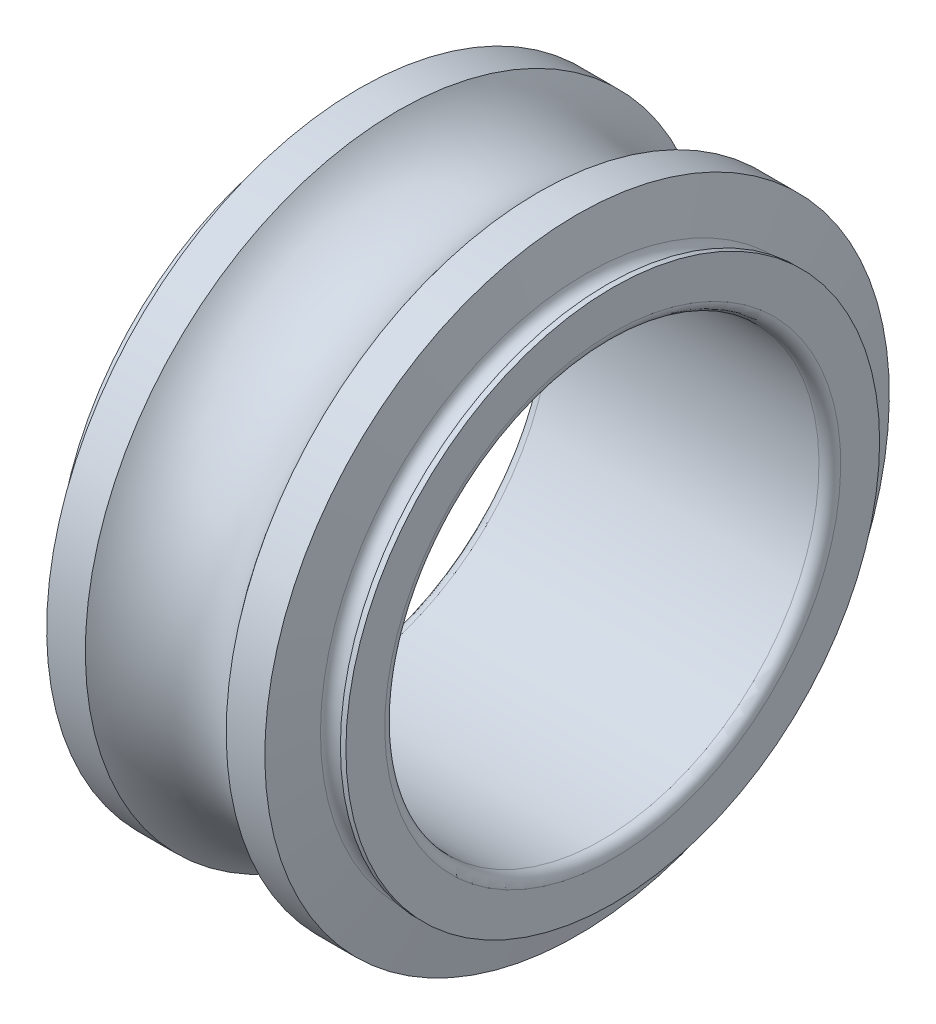
ISO-10303-21;
HEADER;
FILE_DESCRIPTION(('STEP AP214'),'2;1');
FILE_NAME('part.step','',(''),(''),'','','');
FILE_SCHEMA(('AUTOMOTIVE_DESIGN { 1 0 10303 214 1 1 1 1 }'));
ENDSEC;
DATA;
#1=APPLICATION_CONTEXT('core data for automotive mechanical design processes');
#2=APPLICATION_PROTOCOL_DEFINITION('international standard','automotive_design',2000,#1);
#3=PRODUCT_CONTEXT('',#1,'mechanical');
#4=PRODUCT('Part','Part','',(#3));
#5=PRODUCT_RELATED_PRODUCT_CATEGORY('part','',(#4));
#6=PRODUCT_DEFINITION_FORMATION('','',#4);
#7=PRODUCT_DEFINITION_CONTEXT('part definition',#1,'design');
#8=PRODUCT_DEFINITION('design','',#6,#7);
#9=PRODUCT_DEFINITION_SHAPE('','',#8);
#10=(LENGTH_UNIT() NAMED_UNIT(*) SI_UNIT(.MILLI.,.METRE.));
#11=(NAMED_UNIT(*) PLANE_ANGLE_UNIT() SI_UNIT($,.RADIAN.));
#12=(NAMED_UNIT(*) SI_UNIT($,.STERADIAN.) SOLID_ANGLE_UNIT());
#13=UNCERTAINTY_MEASURE_WITH_UNIT(LENGTH_MEASURE(1.E-05),#10,'distance_accuracy_value','');
#14=(GEOMETRIC_REPRESENTATION_CONTEXT(3) GLOBAL_UNCERTAINTY_ASSIGNED_CONTEXT((#13)) GLOBAL_UNIT_ASSIGNED_CONTEXT((#10,
#11,#12)) REPRESENTATION_CONTEXT('',''));
#15=CARTESIAN_POINT('',(0.,0.,0.));
#16=DIRECTION('',(0.,0.,1.));
#17=DIRECTION('',(1.,0.,0.));
#18=AXIS2_PLACEMENT_3D('',#15,#16,#17);
#19=CARTESIAN_POINT('',(6.48036660683857,0.,0.));
#20=DIRECTION('',(-1.,0.,0.));
#21=DIRECTION('',(0.,1.,0.));
#22=AXIS2_PLACEMENT_3D('',#19,#20,#21);
#23=CYLINDRICAL_SURFACE('',#22,8.62875);
#24=CARTESIAN_POINT('',(5.94649285575365,0.,0.));
#25=DIRECTION('',(1.,0.,0.));
#26=DIRECTION('',(0.,1.,0.));
#27=AXIS2_PLACEMENT_3D('',#24,#25,#26);
#28=CIRCLE('',#27,8.62875);
#29=CARTESIAN_POINT('',(5.94649285575365,8.62875,0.));
#30=VERTEX_POINT('',#29);
#31=EDGE_CURVE('E11',#30,#30,#28,.T.);
#32=ORIENTED_EDGE('',*,*,#31,.T.);
#33=EDGE_LOOP('',(#32));
#34=FACE_BOUND('',#33,.T.);
#35=CARTESIAN_POINT('',(7.0142403579235,0.,0.));
#36=DIRECTION('',(1.,0.,0.));
#37=DIRECTION('',(0.,1.,0.));
#38=AXIS2_PLACEMENT_3D('',#35,#36,#37);
#39=CIRCLE('',#38,8.62875);
#40=CARTESIAN_POINT('',(7.0142403579235,8.62875,0.));
#41=VERTEX_POINT('',#40);
#42=EDGE_CURVE('E91',#41,#41,#39,.T.);
#43=ORIENTED_EDGE('',*,*,#42,.F.);
#44=EDGE_LOOP('',(#43));
#45=FACE_BOUND('',#44,.T.);
#46=ADVANCED_FACE('F17',(#34,#45),#23,.T.);
#47=CARTESIAN_POINT('',(4.,0.,0.));
#48=DIRECTION('',(1.,0.,0.));
#49=DIRECTION('',(0.,0.,-1.));
#50=AXIS2_PLACEMENT_3D('',#47,#48,#49);
#51=TOROIDAL_SURFACE('',#50,10.,2.381);
#52=CARTESIAN_POINT('',(2.05350714424635,0.,0.));
#53=DIRECTION('',(1.,0.,0.));
#54=DIRECTION('',(0.,1.,0.));
#55=AXIS2_PLACEMENT_3D('',#52,#53,#54);
#56=CIRCLE('',#55,8.62875);
#57=CARTESIAN_POINT('',(2.05350714424635,8.62875,0.));
#58=VERTEX_POINT('',#57);
#59=EDGE_CURVE('E26',#58,#58,#56,.T.);
#60=ORIENTED_EDGE('',*,*,#59,.T.);
#61=EDGE_LOOP('',(#60));
#62=FACE_BOUND('',#61,.T.);
#63=ORIENTED_EDGE('',*,*,#31,.F.);
#64=EDGE_LOOP('',(#63));
#65=FACE_BOUND('',#64,.T.);
#66=ADVANCED_FACE('F124',(#62,#65),#51,.F.);
#67=CARTESIAN_POINT('',(1.51963339316143,0.,0.));
#68=DIRECTION('',(-1.,0.,0.));
#69=DIRECTION('',(0.,1.,0.));
#70=AXIS2_PLACEMENT_3D('',#67,#68,#69);
#71=CYLINDRICAL_SURFACE('',#70,8.62875);
#72=CARTESIAN_POINT('',(0.985759642076505,0.,0.));
#73=DIRECTION('',(1.,0.,0.));
#74=DIRECTION('',(0.,1.,0.));
#75=AXIS2_PLACEMENT_3D('',#72,#73,#74);
#76=CIRCLE('',#75,8.62875);
#77=CARTESIAN_POINT('',(0.985759642076504,8.62875,0.));
#78=VERTEX_POINT('',#77);
#79=EDGE_CURVE('E78',#78,#78,#76,.T.);
#80=ORIENTED_EDGE('',*,*,#79,.T.);
#81=EDGE_LOOP('',(#80));
#82=FACE_BOUND('',#81,.T.);
#83=ORIENTED_EDGE('',*,*,#59,.F.);
#84=EDGE_LOOP('',(#83));
#85=FACE_BOUND('',#84,.T.);
#86=ADVANCED_FACE('F129',(#82,#85),#71,.T.);
#87=CARTESIAN_POINT('',(0.870570599496108,0.,0.));
#88=DIRECTION('',(1.,0.,0.));
#89=DIRECTION('',(0.,1.,0.));
#90=AXIS2_PLACEMENT_3D('',#87,#88,#89);
#91=CONICAL_SURFACE('',#90,7.97548047699463,1.39626340159546);
#92=CARTESIAN_POINT('',(0.755381556915711,0.,0.));
#93=DIRECTION('',(1.,0.,0.));
#94=DIRECTION('',(0.,1.,0.));
#95=AXIS2_PLACEMENT_3D('',#92,#93,#94);
#96=CIRCLE('',#95,7.32221095398925);
#97=CARTESIAN_POINT('',(0.755381556915711,7.32221095398925,0.));
#98=VERTEX_POINT('',#97);
#99=EDGE_CURVE('E77',#98,#98,#96,.T.);
#100=ORIENTED_EDGE('',*,*,#99,.T.);
#101=EDGE_LOOP('',(#100));
#102=FACE_BOUND('',#101,.T.);
#103=ORIENTED_EDGE('',*,*,#79,.F.);
#104=EDGE_LOOP('',(#103));
#105=FACE_BOUND('',#104,.T.);
#106=ADVANCED_FACE('F134',(#102,#105),#91,.T.);
#107=CARTESIAN_POINT('',(0.456,0.,0.));
#108=DIRECTION('',(1.,0.,0.));
#109=DIRECTION('',(0.,0.,-1.));
#110=AXIS2_PLACEMENT_3D('',#107,#108,#109);
#111=TOROIDAL_SURFACE('',#110,7.375,0.304);
#112=CARTESIAN_POINT('',(0.152,0.,0.));
#113=DIRECTION('',(1.,0.,0.));
#114=DIRECTION('',(0.,1.,0.));
#115=AXIS2_PLACEMENT_3D('',#112,#113,#114);
#116=CIRCLE('',#115,7.375);
#117=CARTESIAN_POINT('',(0.152,7.375,0.));
#118=VERTEX_POINT('',#117);
#119=EDGE_CURVE('E21',#118,#118,#116,.T.);
#120=ORIENTED_EDGE('',*,*,#119,.T.);
#121=EDGE_LOOP('',(#120));
#122=FACE_BOUND('',#121,.T.);
#123=ORIENTED_EDGE('',*,*,#99,.F.);
#124=EDGE_LOOP('',(#123));
#125=FACE_BOUND('',#124,.T.);
#126=ADVANCED_FACE('F19',(#122,#125),#111,.F.);
#127=CARTESIAN_POINT('',(0.076,0.,0.));
#128=DIRECTION('',(-1.,0.,0.));
#129=DIRECTION('',(0.,1.,0.));
#130=AXIS2_PLACEMENT_3D('',#127,#128,#129);
#131=CYLINDRICAL_SURFACE('',#130,7.375);
#132=CARTESIAN_POINT('',(0.,0.,0.));
#133=DIRECTION('',(1.,0.,0.));
#134=DIRECTION('',(0.,1.,0.));
#135=AXIS2_PLACEMENT_3D('',#132,#133,#134);
#136=CIRCLE('',#135,7.375);
#137=CARTESIAN_POINT('',(0.,7.375,0.));
#138=VERTEX_POINT('',#137);
#139=EDGE_CURVE('E71',#138,#138,#136,.T.);
#140=ORIENTED_EDGE('',*,*,#139,.T.);
#141=EDGE_LOOP('',(#140));
#142=FACE_BOUND('',#141,.T.);
#143=ORIENTED_EDGE('',*,*,#119,.F.);
#144=EDGE_LOOP('',(#143));
#145=FACE_BOUND('',#144,.T.);
#146=ADVANCED_FACE('F143',(#142,#145),#131,.T.);
#147=CARTESIAN_POINT('',(0.,6.8375,0.));
#148=DIRECTION('',(-1.,0.,0.));
#149=DIRECTION('',(0.,-1.,0.));
#150=AXIS2_PLACEMENT_3D('',#147,#148,#149);
#151=PLANE('',#150);
#152=CARTESIAN_POINT('',(0.,0.,0.));
#153=DIRECTION('',(1.,0.,0.));
#154=DIRECTION('',(0.,1.,0.));
#155=AXIS2_PLACEMENT_3D('',#152,#153,#154);
#156=CIRCLE('',#155,6.3);
#157=CARTESIAN_POINT('',(0.,6.3,0.));
#158=VERTEX_POINT('',#157);
#159=EDGE_CURVE('E80',#158,#158,#156,.T.);
#160=ORIENTED_EDGE('',*,*,#159,.T.);
#161=EDGE_LOOP('',(#160));
#162=FACE_BOUND('',#161,.T.);
#163=ORIENTED_EDGE('',*,*,#139,.F.);
#164=EDGE_LOOP('',(#163));
#165=FACE_BOUND('',#164,.T.);
#166=ADVANCED_FACE('F145',(#162,#165),#151,.T.);
#167=CARTESIAN_POINT('',(0.3,0.,0.));
#168=DIRECTION('',(1.,0.,0.));
#169=DIRECTION('',(0.,0.,-1.));
#170=AXIS2_PLACEMENT_3D('',#167,#168,#169);
#171=TOROIDAL_SURFACE('',#170,6.3,0.3);
#172=CARTESIAN_POINT('',(0.3,0.,0.));
#173=DIRECTION('',(1.,0.,0.));
#174=DIRECTION('',(0.,1.,0.));
#175=AXIS2_PLACEMENT_3D('',#172,#173,#174);
#176=CIRCLE('',#175,6.);
#177=CARTESIAN_POINT('',(0.3,6.,0.));
#178=VERTEX_POINT('',#177);
#179=EDGE_CURVE('E82',#178,#178,#176,.T.);
#180=ORIENTED_EDGE('',*,*,#179,.T.);
#181=EDGE_LOOP('',(#180));
#182=FACE_BOUND('',#181,.T.);
#183=ORIENTED_EDGE('',*,*,#159,.F.);
#184=EDGE_LOOP('',(#183));
#185=FACE_BOUND('',#184,.T.);
#186=ADVANCED_FACE('F121',(#182,#185),#171,.T.);
#187=CARTESIAN_POINT('',(4.,0.,0.));
#188=DIRECTION('',(-1.,0.,0.));
#189=DIRECTION('',(0.,1.,0.));
#190=AXIS2_PLACEMENT_3D('',#187,#188,#189);
#191=CYLINDRICAL_SURFACE('',#190,6.);
#192=CARTESIAN_POINT('',(7.7,0.,0.));
#193=DIRECTION('',(1.,0.,0.));
#194=DIRECTION('',(0.,1.,0.));
#195=AXIS2_PLACEMENT_3D('',#192,#193,#194);
#196=CIRCLE('',#195,6.);
#197=CARTESIAN_POINT('',(7.7,6.,0.));
#198=VERTEX_POINT('',#197);
#199=EDGE_CURVE('E89',#198,#198,#196,.T.);
#200=ORIENTED_EDGE('',*,*,#199,.T.);
#201=EDGE_LOOP('',(#200));
#202=FACE_BOUND('',#201,.T.);
#203=ORIENTED_EDGE('',*,*,#179,.F.);
#204=EDGE_LOOP('',(#203));
#205=FACE_BOUND('',#204,.T.);
#206=ADVANCED_FACE('F106',(#202,#205),#191,.F.);
#207=CARTESIAN_POINT('',(7.7,0.,0.));
#208=DIRECTION('',(1.,0.,0.));
#209=DIRECTION('',(0.,0.,-1.));
#210=AXIS2_PLACEMENT_3D('',#207,#208,#209);
#211=TOROIDAL_SURFACE('',#210,6.3,0.3);
#212=CARTESIAN_POINT('',(8.,0.,0.));
#213=DIRECTION('',(1.,0.,0.));
#214=DIRECTION('',(0.,1.,0.));
#215=AXIS2_PLACEMENT_3D('',#212,#213,#214);
#216=CIRCLE('',#215,6.3);
#217=CARTESIAN_POINT('',(8.,6.3,0.));
#218=VERTEX_POINT('',#217);
#219=EDGE_CURVE('E99',#218,#218,#216,.T.);
#220=ORIENTED_EDGE('',*,*,#219,.T.);
#221=EDGE_LOOP('',(#220));
#222=FACE_BOUND('',#221,.T.);
#223=ORIENTED_EDGE('',*,*,#199,.F.);
#224=EDGE_LOOP('',(#223));
#225=FACE_BOUND('',#224,.T.);
#226=ADVANCED_FACE('F109',(#222,#225),#211,.T.);
#227=CARTESIAN_POINT('',(8.,6.8375,0.));
#228=DIRECTION('',(1.,0.,0.));
#229=DIRECTION('',(0.,1.,0.));
#230=AXIS2_PLACEMENT_3D('',#227,#228,#229);
#231=PLANE('',#230);
#232=CARTESIAN_POINT('',(8.,0.,0.));
#233=DIRECTION('',(1.,0.,0.));
#234=DIRECTION('',(0.,1.,0.));
#235=AXIS2_PLACEMENT_3D('',#232,#233,#234);
#236=CIRCLE('',#235,7.375);
#237=CARTESIAN_POINT('',(8.,7.375,0.));
#238=VERTEX_POINT('',#237);
#239=EDGE_CURVE('E96',#238,#238,#236,.T.);
#240=ORIENTED_EDGE('',*,*,#239,.T.);
#241=EDGE_LOOP('',(#240));
#242=FACE_BOUND('',#241,.T.);
#243=ORIENTED_EDGE('',*,*,#219,.F.);
#244=EDGE_LOOP('',(#243));
#245=FACE_BOUND('',#244,.T.);
#246=ADVANCED_FACE('F111',(#242,#245),#231,.T.);
#247=CARTESIAN_POINT('',(7.924,0.,0.));
#248=DIRECTION('',(-1.,0.,0.));
#249=DIRECTION('',(0.,1.,0.));
#250=AXIS2_PLACEMENT_3D('',#247,#248,#249);
#251=CYLINDRICAL_SURFACE('',#250,7.375);
#252=CARTESIAN_POINT('',(7.848,0.,0.));
#253=DIRECTION('',(1.,0.,0.));
#254=DIRECTION('',(0.,1.,0.));
#255=AXIS2_PLACEMENT_3D('',#252,#253,#254);
#256=CIRCLE('',#255,7.375);
#257=CARTESIAN_POINT('',(7.848,7.375,0.));
#258=VERTEX_POINT('',#257);
#259=EDGE_CURVE('E85',#258,#258,#256,.T.);
#260=ORIENTED_EDGE('',*,*,#259,.T.);
#261=EDGE_LOOP('',(#260));
#262=FACE_BOUND('',#261,.T.);
#263=ORIENTED_EDGE('',*,*,#239,.F.);
#264=EDGE_LOOP('',(#263));
#265=FACE_BOUND('',#264,.T.);
#266=ADVANCED_FACE('F119',(#262,#265),#251,.T.);
#267=CARTESIAN_POINT('',(7.544,0.,0.));
#268=DIRECTION('',(1.,0.,0.));
#269=DIRECTION('',(0.,0.,-1.));
#270=AXIS2_PLACEMENT_3D('',#267,#268,#269);
#271=TOROIDAL_SURFACE('',#270,7.375,0.304);
#272=CARTESIAN_POINT('',(7.24461844308429,0.,0.));
#273=DIRECTION('',(1.,0.,0.));
#274=DIRECTION('',(0.,1.,0.));
#275=AXIS2_PLACEMENT_3D('',#272,#273,#274);
#276=CIRCLE('',#275,7.32221095398925);
#277=CARTESIAN_POINT('',(7.24461844308429,7.32221095398925,0.));
#278=VERTEX_POINT('',#277);
#279=EDGE_CURVE('E90',#278,#278,#276,.T.);
#280=ORIENTED_EDGE('',*,*,#279,.T.);
#281=EDGE_LOOP('',(#280));
#282=FACE_BOUND('',#281,.T.);
#283=ORIENTED_EDGE('',*,*,#259,.F.);
#284=EDGE_LOOP('',(#283));
#285=FACE_BOUND('',#284,.T.);
#286=ADVANCED_FACE('F135',(#282,#285),#271,.F.);
#287=CARTESIAN_POINT('',(7.12942940050389,0.,0.));
#288=DIRECTION('',(-1.,0.,0.));
#289=DIRECTION('',(0.,1.,0.));
#290=AXIS2_PLACEMENT_3D('',#287,#288,#289);
#291=CONICAL_SURFACE('',#290,7.97548047699463,1.39626340159546);
#292=ORIENTED_EDGE('',*,*,#42,.T.);
#293=EDGE_LOOP('',(#292));
#294=FACE_BOUND('',#293,.T.);
#295=ORIENTED_EDGE('',*,*,#279,.F.);
#296=EDGE_LOOP('',(#295));
#297=FACE_BOUND('',#296,.T.);
#298=ADVANCED_FACE('F138',(#294,#297),#291,.T.);
#299=CLOSED_SHELL('',(#46,#66,#86,#106,#126,#146,#166,#186,#206,#226,#246,#266,#286,#298));
#300=MANIFOLD_SOLID_BREP('B1',#299);
#301=ADVANCED_BREP_SHAPE_REPRESENTATION('',(#18,#300),#14);
#302=SHAPE_DEFINITION_REPRESENTATION(#9,#301);
ENDSEC;
END-ISO-10303-21;
